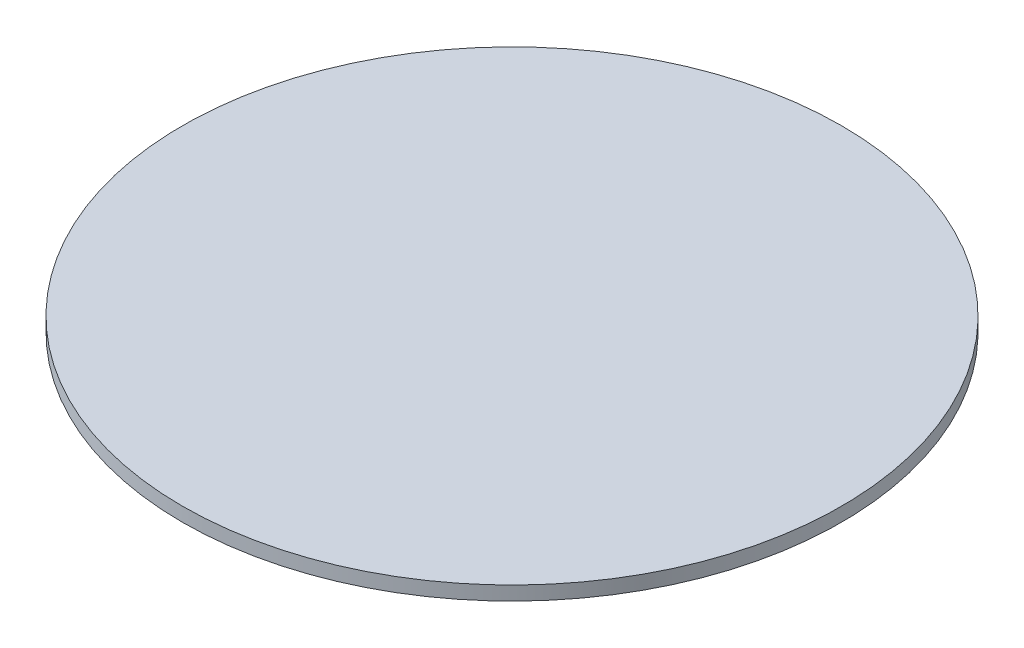
ISO-10303-21;
HEADER;
FILE_DESCRIPTION(('STEP AP214'),'2;1');
FILE_NAME('part.step','',(''),(''),'','','');
FILE_SCHEMA(('AUTOMOTIVE_DESIGN { 1 0 10303 214 1 1 1 1 }'));
ENDSEC;
DATA;
#1=APPLICATION_CONTEXT('core data for automotive mechanical design processes');
#2=APPLICATION_PROTOCOL_DEFINITION('international standard','automotive_design',2000,#1);
#3=PRODUCT_CONTEXT('',#1,'mechanical');
#4=PRODUCT('Part','Part','',(#3));
#5=PRODUCT_RELATED_PRODUCT_CATEGORY('part','',(#4));
#6=PRODUCT_DEFINITION_FORMATION('','',#4);
#7=PRODUCT_DEFINITION_CONTEXT('part definition',#1,'design');
#8=PRODUCT_DEFINITION('design','',#6,#7);
#9=PRODUCT_DEFINITION_SHAPE('','',#8);
#10=(LENGTH_UNIT() NAMED_UNIT(*) SI_UNIT(.MILLI.,.METRE.));
#11=(NAMED_UNIT(*) PLANE_ANGLE_UNIT() SI_UNIT($,.RADIAN.));
#12=(NAMED_UNIT(*) SI_UNIT($,.STERADIAN.) SOLID_ANGLE_UNIT());
#13=UNCERTAINTY_MEASURE_WITH_UNIT(LENGTH_MEASURE(1.E-05),#10,'distance_accuracy_value','');
#14=(GEOMETRIC_REPRESENTATION_CONTEXT(3) GLOBAL_UNCERTAINTY_ASSIGNED_CONTEXT((#13)) GLOBAL_UNIT_ASSIGNED_CONTEXT((#10,
#11,#12)) REPRESENTATION_CONTEXT('',''));
#15=CARTESIAN_POINT('',(0.,0.,0.));
#16=DIRECTION('',(0.,0.,1.));
#17=DIRECTION('',(1.,0.,0.));
#18=AXIS2_PLACEMENT_3D('',#15,#16,#17);
#19=CARTESIAN_POINT('',(0.,3.175,0.));
#20=DIRECTION('',(0.,-1.,0.));
#21=DIRECTION('',(0.,0.,-1.));
#22=AXIS2_PLACEMENT_3D('',#19,#20,#21);
#23=CYLINDRICAL_SURFACE('',#22,75.);
#24=CARTESIAN_POINT('',(0.,3.175,0.));
#25=DIRECTION('',(0.,1.,0.));
#26=DIRECTION('',(0.,0.,1.));
#27=AXIS2_PLACEMENT_3D('',#24,#25,#26);
#28=CIRCLE('',#27,75.);
#29=CARTESIAN_POINT('',(0.,3.175,75.));
#30=VERTEX_POINT('',#29);
#31=EDGE_CURVE('E10',#30,#30,#28,.T.);
#32=ORIENTED_EDGE('',*,*,#31,.F.);
#33=EDGE_LOOP('',(#32));
#34=FACE_BOUND('',#33,.T.);
#35=CARTESIAN_POINT('',(0.,0.,0.));
#36=DIRECTION('',(0.,1.,0.));
#37=DIRECTION('',(0.,0.,1.));
#38=AXIS2_PLACEMENT_3D('',#35,#36,#37);
#39=CIRCLE('',#38,75.);
#40=CARTESIAN_POINT('',(0.,0.,75.));
#41=VERTEX_POINT('',#40);
#42=EDGE_CURVE('E34',#41,#41,#39,.T.);
#43=ORIENTED_EDGE('',*,*,#42,.T.);
#44=EDGE_LOOP('',(#43));
#45=FACE_BOUND('',#44,.T.);
#46=ADVANCED_FACE('F31',(#34,#45),#23,.T.);
#47=CARTESIAN_POINT('',(0.,3.175,0.));
#48=DIRECTION('',(0.,1.,0.));
#49=DIRECTION('',(0.,0.,1.));
#50=AXIS2_PLACEMENT_3D('',#47,#48,#49);
#51=PLANE('',#50);
#52=ORIENTED_EDGE('',*,*,#31,.T.);
#53=EDGE_LOOP('',(#52));
#54=FACE_BOUND('',#53,.T.);
#55=ADVANCED_FACE('F46',(#54),#51,.T.);
#56=CARTESIAN_POINT('',(0.,0.,0.));
#57=DIRECTION('',(0.,1.,0.));
#58=DIRECTION('',(0.,0.,1.));
#59=AXIS2_PLACEMENT_3D('',#56,#57,#58);
#60=PLANE('',#59);
#61=ORIENTED_EDGE('',*,*,#42,.F.);
#62=EDGE_LOOP('',(#61));
#63=FACE_BOUND('',#62,.T.);
#64=ADVANCED_FACE('F44',(#63),#60,.F.);
#65=CLOSED_SHELL('',(#46,#55,#64));
#66=MANIFOLD_SOLID_BREP('B2',#65);
#67=ADVANCED_BREP_SHAPE_REPRESENTATION('',(#18,#66),#14);
#68=SHAPE_DEFINITION_REPRESENTATION(#9,#67);
ENDSEC;
END-ISO-10303-21;
